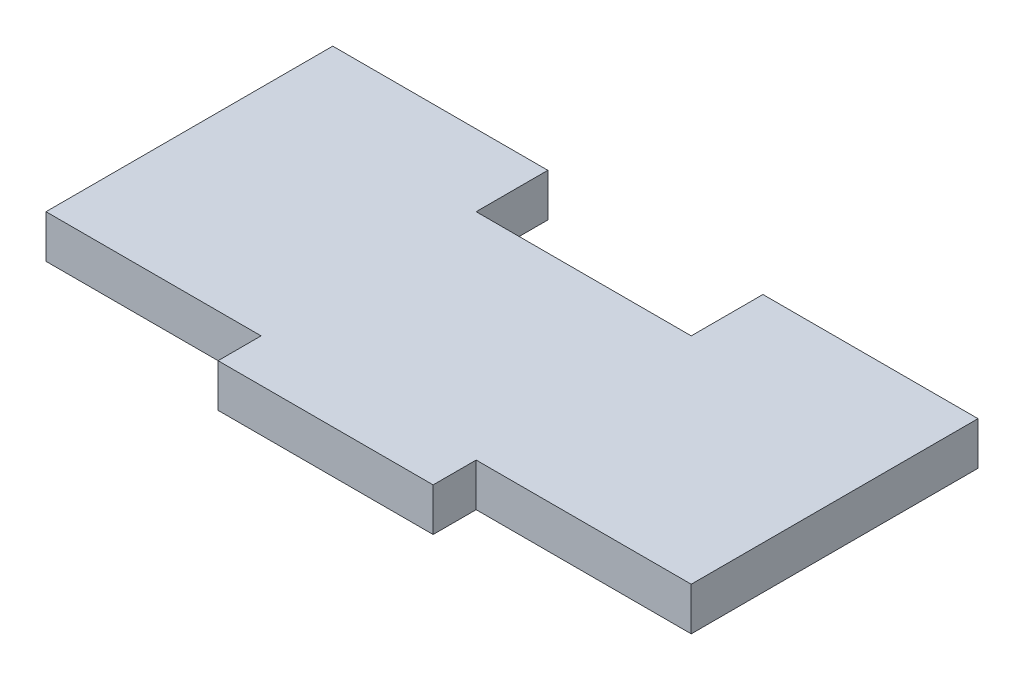
ISO-10303-21;
HEADER;
FILE_DESCRIPTION(('STEP AP214'),'2;1');
FILE_NAME('part.step','',(''),(''),'','','');
FILE_SCHEMA(('AUTOMOTIVE_DESIGN { 1 0 10303 214 1 1 1 1 }'));
ENDSEC;
DATA;
#1=APPLICATION_CONTEXT('core data for automotive mechanical design processes');
#2=APPLICATION_PROTOCOL_DEFINITION('international standard','automotive_design',2000,#1);
#3=PRODUCT_CONTEXT('',#1,'mechanical');
#4=PRODUCT('Part','Part','',(#3));
#5=PRODUCT_RELATED_PRODUCT_CATEGORY('part','',(#4));
#6=PRODUCT_DEFINITION_FORMATION('','',#4);
#7=PRODUCT_DEFINITION_CONTEXT('part definition',#1,'design');
#8=PRODUCT_DEFINITION('design','',#6,#7);
#9=PRODUCT_DEFINITION_SHAPE('','',#8);
#10=(LENGTH_UNIT() NAMED_UNIT(*) SI_UNIT(.MILLI.,.METRE.));
#11=(NAMED_UNIT(*) PLANE_ANGLE_UNIT() SI_UNIT($,.RADIAN.));
#12=(NAMED_UNIT(*) SI_UNIT($,.STERADIAN.) SOLID_ANGLE_UNIT());
#13=UNCERTAINTY_MEASURE_WITH_UNIT(LENGTH_MEASURE(1.E-05),#10,'distance_accuracy_value','');
#14=(GEOMETRIC_REPRESENTATION_CONTEXT(3) GLOBAL_UNCERTAINTY_ASSIGNED_CONTEXT((#13)) GLOBAL_UNIT_ASSIGNED_CONTEXT((#10,
#11,#12)) REPRESENTATION_CONTEXT('',''));
#15=CARTESIAN_POINT('',(0.,0.,0.));
#16=DIRECTION('',(0.,0.,1.));
#17=DIRECTION('',(1.,0.,0.));
#18=AXIS2_PLACEMENT_3D('',#15,#16,#17);
#19=CARTESIAN_POINT('',(-22.5,3.,-11.5));
#20=DIRECTION('',(0.,0.,1.));
#21=DIRECTION('',(1.,0.,0.));
#22=AXIS2_PLACEMENT_3D('',#19,#20,#21);
#23=PLANE('',#22);
#24=DIRECTION('',(-1.,0.,0.));
#25=VECTOR('',#24,1.);
#26=CARTESIAN_POINT('',(-22.5,3.,-11.5));
#27=LINE('',#26,#25);
#28=CARTESIAN_POINT('',(-7.50000000000001,3.,-11.5));
#29=VERTEX_POINT('',#28);
#30=CARTESIAN_POINT('',(-22.5,3.,-11.5));
#31=VERTEX_POINT('',#30);
#32=EDGE_CURVE('E158',#29,#31,#27,.T.);
#33=ORIENTED_EDGE('',*,*,#32,.F.);
#34=DIRECTION('',(0.,1.,0.));
#35=VECTOR('',#34,1.);
#36=CARTESIAN_POINT('',(-7.50000000000001,0.,-11.5));
#37=LINE('',#36,#35);
#38=CARTESIAN_POINT('',(-7.50000000000001,0.,-11.5));
#39=VERTEX_POINT('',#38);
#40=EDGE_CURVE('E184',#39,#29,#37,.T.);
#41=ORIENTED_EDGE('',*,*,#40,.F.);
#42=DIRECTION('',(-1.,0.,0.));
#43=VECTOR('',#42,1.);
#44=CARTESIAN_POINT('',(-22.5,0.,-11.5));
#45=LINE('',#44,#43);
#46=CARTESIAN_POINT('',(-22.5,0.,-11.5));
#47=VERTEX_POINT('',#46);
#48=EDGE_CURVE('E183',#39,#47,#45,.T.);
#49=ORIENTED_EDGE('',*,*,#48,.T.);
#50=DIRECTION('',(0.,-1.,0.));
#51=VECTOR('',#50,1.);
#52=CARTESIAN_POINT('',(-22.5,3.,-11.5));
#53=LINE('',#52,#51);
#54=EDGE_CURVE('E48',#31,#47,#53,.T.);
#55=ORIENTED_EDGE('',*,*,#54,.F.);
#56=EDGE_LOOP('',(#33,#41,#49,#55));
#57=FACE_BOUND('',#56,.T.);
#58=ADVANCED_FACE('F39',(#57),#23,.F.);
#59=CARTESIAN_POINT('',(22.5,3.,11.5));
#60=DIRECTION('',(-1.,0.,0.));
#61=DIRECTION('',(0.,0.,1.));
#62=AXIS2_PLACEMENT_3D('',#59,#60,#61);
#63=PLANE('',#62);
#64=DIRECTION('',(0.,0.,-1.));
#65=VECTOR('',#64,1.);
#66=CARTESIAN_POINT('',(22.5,3.,11.5));
#67=LINE('',#66,#65);
#68=CARTESIAN_POINT('',(22.5,3.,8.5));
#69=VERTEX_POINT('',#68);
#70=CARTESIAN_POINT('',(22.5,3.,-11.5));
#71=VERTEX_POINT('',#70);
#72=EDGE_CURVE('E153',#69,#71,#67,.T.);
#73=ORIENTED_EDGE('',*,*,#72,.F.);
#74=DIRECTION('',(0.,1.,0.));
#75=VECTOR('',#74,1.);
#76=CARTESIAN_POINT('',(22.5,0.,8.5));
#77=LINE('',#76,#75);
#78=CARTESIAN_POINT('',(22.5,0.,8.5));
#79=VERTEX_POINT('',#78);
#80=EDGE_CURVE('E242',#79,#69,#77,.T.);
#81=ORIENTED_EDGE('',*,*,#80,.F.);
#82=DIRECTION('',(0.,0.,-1.));
#83=VECTOR('',#82,1.);
#84=CARTESIAN_POINT('',(22.5,0.,11.5));
#85=LINE('',#84,#83);
#86=CARTESIAN_POINT('',(22.5,0.,-11.5));
#87=VERTEX_POINT('',#86);
#88=EDGE_CURVE('E181',#79,#87,#85,.T.);
#89=ORIENTED_EDGE('',*,*,#88,.T.);
#90=DIRECTION('',(0.,-1.,0.));
#91=VECTOR('',#90,1.);
#92=CARTESIAN_POINT('',(22.5,3.,-11.5));
#93=LINE('',#92,#91);
#94=EDGE_CURVE('E11',#71,#87,#93,.T.);
#95=ORIENTED_EDGE('',*,*,#94,.F.);
#96=EDGE_LOOP('',(#73,#81,#89,#95));
#97=FACE_BOUND('',#96,.T.);
#98=ADVANCED_FACE('F41',(#97),#63,.F.);
#99=CARTESIAN_POINT('',(7.49999999999999,0.,-11.5));
#100=VERTEX_POINT('',#99);
#101=EDGE_CURVE('E161',#87,#100,#45,.T.);
#102=ORIENTED_EDGE('',*,*,#101,.T.);
#103=DIRECTION('',(0.,1.,0.));
#104=VECTOR('',#103,1.);
#105=CARTESIAN_POINT('',(7.49999999999999,0.,-11.5));
#106=LINE('',#105,#104);
#107=CARTESIAN_POINT('',(7.49999999999999,3.,-11.5));
#108=VERTEX_POINT('',#107);
#109=EDGE_CURVE('E220',#100,#108,#106,.T.);
#110=ORIENTED_EDGE('',*,*,#109,.T.);
#111=EDGE_CURVE('E177',#71,#108,#27,.T.);
#112=ORIENTED_EDGE('',*,*,#111,.F.);
#113=ORIENTED_EDGE('',*,*,#94,.T.);
#114=EDGE_LOOP('',(#102,#110,#112,#113));
#115=FACE_BOUND('',#114,.T.);
#116=ADVANCED_FACE('F284',(#115),#23,.F.);
#117=CARTESIAN_POINT('',(-22.5,3.,11.5));
#118=DIRECTION('',(1.,0.,0.));
#119=DIRECTION('',(0.,0.,-1.));
#120=AXIS2_PLACEMENT_3D('',#117,#118,#119);
#121=PLANE('',#120);
#122=DIRECTION('',(0.,0.,1.));
#123=VECTOR('',#122,1.);
#124=CARTESIAN_POINT('',(-22.5,0.,11.5));
#125=LINE('',#124,#123);
#126=CARTESIAN_POINT('',(-22.5,0.,8.5));
#127=VERTEX_POINT('',#126);
#128=EDGE_CURVE('E154',#47,#127,#125,.T.);
#129=ORIENTED_EDGE('',*,*,#128,.T.);
#130=DIRECTION('',(0.,1.,0.));
#131=VECTOR('',#130,1.);
#132=CARTESIAN_POINT('',(-22.5,0.,8.5));
#133=LINE('',#132,#131);
#134=CARTESIAN_POINT('',(-22.5,3.,8.5));
#135=VERTEX_POINT('',#134);
#136=EDGE_CURVE('E200',#127,#135,#133,.T.);
#137=ORIENTED_EDGE('',*,*,#136,.T.);
#138=DIRECTION('',(0.,0.,1.));
#139=VECTOR('',#138,1.);
#140=CARTESIAN_POINT('',(-22.5,3.,11.5));
#141=LINE('',#140,#139);
#142=EDGE_CURVE('E171',#31,#135,#141,.T.);
#143=ORIENTED_EDGE('',*,*,#142,.F.);
#144=ORIENTED_EDGE('',*,*,#54,.T.);
#145=EDGE_LOOP('',(#129,#137,#143,#144));
#146=FACE_BOUND('',#145,.T.);
#147=ADVANCED_FACE('F199',(#146),#121,.F.);
#148=CARTESIAN_POINT('',(-22.5,3.,11.5));
#149=DIRECTION('',(0.,0.,-1.));
#150=DIRECTION('',(-1.,0.,0.));
#151=AXIS2_PLACEMENT_3D('',#148,#149,#150);
#152=PLANE('',#151);
#153=DIRECTION('',(1.,0.,0.));
#154=VECTOR('',#153,1.);
#155=CARTESIAN_POINT('',(-22.5,3.,11.5));
#156=LINE('',#155,#154);
#157=CARTESIAN_POINT('',(-7.5,3.,11.5));
#158=VERTEX_POINT('',#157);
#159=CARTESIAN_POINT('',(7.5,3.,11.5));
#160=VERTEX_POINT('',#159);
#161=EDGE_CURVE('E147',#158,#160,#156,.T.);
#162=ORIENTED_EDGE('',*,*,#161,.F.);
#163=DIRECTION('',(0.,1.,0.));
#164=VECTOR('',#163,1.);
#165=CARTESIAN_POINT('',(-7.5,0.,11.5));
#166=LINE('',#165,#164);
#167=CARTESIAN_POINT('',(-7.5,0.,11.5));
#168=VERTEX_POINT('',#167);
#169=EDGE_CURVE('E132',#168,#158,#166,.T.);
#170=ORIENTED_EDGE('',*,*,#169,.F.);
#171=DIRECTION('',(1.,0.,0.));
#172=VECTOR('',#171,1.);
#173=CARTESIAN_POINT('',(-22.5,0.,11.5));
#174=LINE('',#173,#172);
#175=CARTESIAN_POINT('',(7.5,0.,11.5));
#176=VERTEX_POINT('',#175);
#177=EDGE_CURVE('E145',#168,#176,#174,.T.);
#178=ORIENTED_EDGE('',*,*,#177,.T.);
#179=DIRECTION('',(0.,1.,0.));
#180=VECTOR('',#179,1.);
#181=CARTESIAN_POINT('',(7.5,0.,11.5));
#182=LINE('',#181,#180);
#183=EDGE_CURVE('E248',#176,#160,#182,.T.);
#184=ORIENTED_EDGE('',*,*,#183,.T.);
#185=EDGE_LOOP('',(#162,#170,#178,#184));
#186=FACE_BOUND('',#185,.T.);
#187=ADVANCED_FACE('F143',(#186),#152,.F.);
#188=CARTESIAN_POINT('',(0.,3.,0.));
#189=DIRECTION('',(0.,-1.,0.));
#190=DIRECTION('',(0.,0.,-1.));
#191=AXIS2_PLACEMENT_3D('',#188,#189,#190);
#192=PLANE('',#191);
#193=ORIENTED_EDGE('',*,*,#142,.T.);
#194=DIRECTION('',(-1.,0.,0.));
#195=VECTOR('',#194,1.);
#196=CARTESIAN_POINT('',(-22.5,3.,8.5));
#197=LINE('',#196,#195);
#198=CARTESIAN_POINT('',(-7.5,3.,8.5));
#199=VERTEX_POINT('',#198);
#200=EDGE_CURVE('E138',#199,#135,#197,.T.);
#201=ORIENTED_EDGE('',*,*,#200,.F.);
#202=DIRECTION('',(0.,0.,-1.));
#203=VECTOR('',#202,1.);
#204=CARTESIAN_POINT('',(-7.5,3.,11.5));
#205=LINE('',#204,#203);
#206=EDGE_CURVE('E251',#158,#199,#205,.T.);
#207=ORIENTED_EDGE('',*,*,#206,.F.);
#208=ORIENTED_EDGE('',*,*,#161,.T.);
#209=DIRECTION('',(0.,0.,1.));
#210=VECTOR('',#209,1.);
#211=CARTESIAN_POINT('',(7.5,3.,11.5));
#212=LINE('',#211,#210);
#213=CARTESIAN_POINT('',(7.5,3.,8.5));
#214=VERTEX_POINT('',#213);
#215=EDGE_CURVE('E252',#214,#160,#212,.T.);
#216=ORIENTED_EDGE('',*,*,#215,.F.);
#217=DIRECTION('',(-1.,0.,0.));
#218=VECTOR('',#217,1.);
#219=CARTESIAN_POINT('',(22.5,3.,8.5));
#220=LINE('',#219,#218);
#221=EDGE_CURVE('E256',#69,#214,#220,.T.);
#222=ORIENTED_EDGE('',*,*,#221,.F.);
#223=ORIENTED_EDGE('',*,*,#72,.T.);
#224=ORIENTED_EDGE('',*,*,#111,.T.);
#225=DIRECTION('',(0.,0.,-1.));
#226=VECTOR('',#225,1.);
#227=CARTESIAN_POINT('',(7.49999999999999,3.,-11.5));
#228=LINE('',#227,#226);
#229=CARTESIAN_POINT('',(7.49999999999999,3.,-6.5));
#230=VERTEX_POINT('',#229);
#231=EDGE_CURVE('E225',#230,#108,#228,.T.);
#232=ORIENTED_EDGE('',*,*,#231,.F.);
#233=DIRECTION('',(1.,0.,0.));
#234=VECTOR('',#233,1.);
#235=CARTESIAN_POINT('',(-7.50000000000001,3.,-6.5));
#236=LINE('',#235,#234);
#237=CARTESIAN_POINT('',(-7.50000000000001,3.,-6.5));
#238=VERTEX_POINT('',#237);
#239=EDGE_CURVE('E228',#238,#230,#236,.T.);
#240=ORIENTED_EDGE('',*,*,#239,.F.);
#241=DIRECTION('',(0.,0.,1.));
#242=VECTOR('',#241,1.);
#243=CARTESIAN_POINT('',(-7.50000000000001,3.,-11.5));
#244=LINE('',#243,#242);
#245=EDGE_CURVE('E202',#29,#238,#244,.T.);
#246=ORIENTED_EDGE('',*,*,#245,.F.);
#247=ORIENTED_EDGE('',*,*,#32,.T.);
#248=EDGE_LOOP('',(#193,#201,#207,#208,#216,#222,#223,#224,#232,#240,#246,#247));
#249=FACE_BOUND('',#248,.T.);
#250=ADVANCED_FACE('F205',(#249),#192,.F.);
#251=CARTESIAN_POINT('',(0.,0.,0.));
#252=DIRECTION('',(0.,-1.,0.));
#253=DIRECTION('',(0.,0.,-1.));
#254=AXIS2_PLACEMENT_3D('',#251,#252,#253);
#255=PLANE('',#254);
#256=DIRECTION('',(-1.,0.,0.));
#257=VECTOR('',#256,1.);
#258=CARTESIAN_POINT('',(-22.5,0.,8.5));
#259=LINE('',#258,#257);
#260=CARTESIAN_POINT('',(-7.5,0.,8.5));
#261=VERTEX_POINT('',#260);
#262=EDGE_CURVE('E55',#261,#127,#259,.T.);
#263=ORIENTED_EDGE('',*,*,#262,.T.);
#264=ORIENTED_EDGE('',*,*,#128,.F.);
#265=ORIENTED_EDGE('',*,*,#48,.F.);
#266=DIRECTION('',(0.,0.,1.));
#267=VECTOR('',#266,1.);
#268=CARTESIAN_POINT('',(-7.50000000000001,0.,-11.5));
#269=LINE('',#268,#267);
#270=CARTESIAN_POINT('',(-7.50000000000001,0.,-6.5));
#271=VERTEX_POINT('',#270);
#272=EDGE_CURVE('E197',#39,#271,#269,.T.);
#273=ORIENTED_EDGE('',*,*,#272,.T.);
#274=DIRECTION('',(1.,0.,0.));
#275=VECTOR('',#274,1.);
#276=CARTESIAN_POINT('',(-7.50000000000001,0.,-6.5));
#277=LINE('',#276,#275);
#278=CARTESIAN_POINT('',(7.49999999999999,0.,-6.5));
#279=VERTEX_POINT('',#278);
#280=EDGE_CURVE('E237',#271,#279,#277,.T.);
#281=ORIENTED_EDGE('',*,*,#280,.T.);
#282=DIRECTION('',(0.,0.,-1.));
#283=VECTOR('',#282,1.);
#284=CARTESIAN_POINT('',(7.49999999999999,0.,-11.5));
#285=LINE('',#284,#283);
#286=EDGE_CURVE('E217',#279,#100,#285,.T.);
#287=ORIENTED_EDGE('',*,*,#286,.T.);
#288=ORIENTED_EDGE('',*,*,#101,.F.);
#289=ORIENTED_EDGE('',*,*,#88,.F.);
#290=DIRECTION('',(-1.,0.,0.));
#291=VECTOR('',#290,1.);
#292=CARTESIAN_POINT('',(22.5,0.,8.5));
#293=LINE('',#292,#291);
#294=CARTESIAN_POINT('',(7.5,0.,8.5));
#295=VERTEX_POINT('',#294);
#296=EDGE_CURVE('E255',#79,#295,#293,.T.);
#297=ORIENTED_EDGE('',*,*,#296,.T.);
#298=DIRECTION('',(0.,0.,1.));
#299=VECTOR('',#298,1.);
#300=CARTESIAN_POINT('',(7.5,0.,11.5));
#301=LINE('',#300,#299);
#302=EDGE_CURVE('E63',#295,#176,#301,.T.);
#303=ORIENTED_EDGE('',*,*,#302,.T.);
#304=ORIENTED_EDGE('',*,*,#177,.F.);
#305=DIRECTION('',(0.,0.,-1.));
#306=VECTOR('',#305,1.);
#307=CARTESIAN_POINT('',(-7.5,0.,11.5));
#308=LINE('',#307,#306);
#309=EDGE_CURVE('E128',#168,#261,#308,.T.);
#310=ORIENTED_EDGE('',*,*,#309,.T.);
#311=EDGE_LOOP('',(#263,#264,#265,#273,#281,#287,#288,#289,#297,#303,#304,#310));
#312=FACE_BOUND('',#311,.T.);
#313=ADVANCED_FACE('F150',(#312),#255,.T.);
#314=CARTESIAN_POINT('',(-7.50000000000001,0.,-11.5));
#315=DIRECTION('',(-1.,0.,0.));
#316=DIRECTION('',(0.,0.,1.));
#317=AXIS2_PLACEMENT_3D('',#314,#315,#316);
#318=PLANE('',#317);
#319=ORIENTED_EDGE('',*,*,#245,.T.);
#320=DIRECTION('',(0.,1.,0.));
#321=VECTOR('',#320,1.);
#322=CARTESIAN_POINT('',(-7.50000000000001,0.,-6.5));
#323=LINE('',#322,#321);
#324=EDGE_CURVE('E213',#271,#238,#323,.T.);
#325=ORIENTED_EDGE('',*,*,#324,.F.);
#326=ORIENTED_EDGE('',*,*,#272,.F.);
#327=ORIENTED_EDGE('',*,*,#40,.T.);
#328=EDGE_LOOP('',(#319,#325,#326,#327));
#329=FACE_BOUND('',#328,.T.);
#330=ADVANCED_FACE('F301',(#329),#318,.F.);
#331=CARTESIAN_POINT('',(7.49999999999999,0.,-11.5));
#332=DIRECTION('',(1.,0.,0.));
#333=DIRECTION('',(0.,0.,-1.));
#334=AXIS2_PLACEMENT_3D('',#331,#332,#333);
#335=PLANE('',#334);
#336=ORIENTED_EDGE('',*,*,#231,.T.);
#337=ORIENTED_EDGE('',*,*,#109,.F.);
#338=ORIENTED_EDGE('',*,*,#286,.F.);
#339=DIRECTION('',(0.,1.,0.));
#340=VECTOR('',#339,1.);
#341=CARTESIAN_POINT('',(7.49999999999999,0.,-6.5));
#342=LINE('',#341,#340);
#343=EDGE_CURVE('E216',#279,#230,#342,.T.);
#344=ORIENTED_EDGE('',*,*,#343,.T.);
#345=EDGE_LOOP('',(#336,#337,#338,#344));
#346=FACE_BOUND('',#345,.T.);
#347=ADVANCED_FACE('F306',(#346),#335,.F.);
#348=CARTESIAN_POINT('',(-7.50000000000001,0.,-6.5));
#349=DIRECTION('',(0.,0.,1.));
#350=DIRECTION('',(1.,0.,0.));
#351=AXIS2_PLACEMENT_3D('',#348,#349,#350);
#352=PLANE('',#351);
#353=ORIENTED_EDGE('',*,*,#239,.T.);
#354=ORIENTED_EDGE('',*,*,#343,.F.);
#355=ORIENTED_EDGE('',*,*,#280,.F.);
#356=ORIENTED_EDGE('',*,*,#324,.T.);
#357=EDGE_LOOP('',(#353,#354,#355,#356));
#358=FACE_BOUND('',#357,.T.);
#359=ADVANCED_FACE('F308',(#358),#352,.F.);
#360=CARTESIAN_POINT('',(7.5,0.,11.5));
#361=DIRECTION('',(-1.,0.,0.));
#362=DIRECTION('',(0.,0.,1.));
#363=AXIS2_PLACEMENT_3D('',#360,#361,#362);
#364=PLANE('',#363);
#365=ORIENTED_EDGE('',*,*,#215,.T.);
#366=ORIENTED_EDGE('',*,*,#183,.F.);
#367=ORIENTED_EDGE('',*,*,#302,.F.);
#368=DIRECTION('',(0.,1.,0.));
#369=VECTOR('',#368,1.);
#370=CARTESIAN_POINT('',(7.5,0.,8.5));
#371=LINE('',#370,#369);
#372=EDGE_CURVE('E245',#295,#214,#371,.T.);
#373=ORIENTED_EDGE('',*,*,#372,.T.);
#374=EDGE_LOOP('',(#365,#366,#367,#373));
#375=FACE_BOUND('',#374,.T.);
#376=ADVANCED_FACE('F280',(#375),#364,.F.);
#377=CARTESIAN_POINT('',(22.5,0.,8.5));
#378=DIRECTION('',(0.,0.,-1.));
#379=DIRECTION('',(-1.,0.,0.));
#380=AXIS2_PLACEMENT_3D('',#377,#378,#379);
#381=PLANE('',#380);
#382=ORIENTED_EDGE('',*,*,#221,.T.);
#383=ORIENTED_EDGE('',*,*,#372,.F.);
#384=ORIENTED_EDGE('',*,*,#296,.F.);
#385=ORIENTED_EDGE('',*,*,#80,.T.);
#386=EDGE_LOOP('',(#382,#383,#384,#385));
#387=FACE_BOUND('',#386,.T.);
#388=ADVANCED_FACE('F273',(#387),#381,.F.);
#389=CARTESIAN_POINT('',(-22.5,0.,8.5));
#390=DIRECTION('',(0.,0.,-1.));
#391=DIRECTION('',(-1.,0.,0.));
#392=AXIS2_PLACEMENT_3D('',#389,#390,#391);
#393=PLANE('',#392);
#394=ORIENTED_EDGE('',*,*,#200,.T.);
#395=ORIENTED_EDGE('',*,*,#136,.F.);
#396=ORIENTED_EDGE('',*,*,#262,.F.);
#397=DIRECTION('',(0.,1.,0.));
#398=VECTOR('',#397,1.);
#399=CARTESIAN_POINT('',(-7.5,0.,8.5));
#400=LINE('',#399,#398);
#401=EDGE_CURVE('E134',#261,#199,#400,.T.);
#402=ORIENTED_EDGE('',*,*,#401,.T.);
#403=EDGE_LOOP('',(#394,#395,#396,#402));
#404=FACE_BOUND('',#403,.T.);
#405=ADVANCED_FACE('F271',(#404),#393,.F.);
#406=CARTESIAN_POINT('',(-7.5,0.,11.5));
#407=DIRECTION('',(1.,0.,0.));
#408=DIRECTION('',(0.,0.,-1.));
#409=AXIS2_PLACEMENT_3D('',#406,#407,#408);
#410=PLANE('',#409);
#411=ORIENTED_EDGE('',*,*,#206,.T.);
#412=ORIENTED_EDGE('',*,*,#401,.F.);
#413=ORIENTED_EDGE('',*,*,#309,.F.);
#414=ORIENTED_EDGE('',*,*,#169,.T.);
#415=EDGE_LOOP('',(#411,#412,#413,#414));
#416=FACE_BOUND('',#415,.T.);
#417=ADVANCED_FACE('F131',(#416),#410,.F.);
#418=CLOSED_SHELL('',(#58,#98,#116,#147,#187,#250,#313,#330,#347,#359,#376,#388,#405,#417));
#419=MANIFOLD_SOLID_BREP('B2',#418);
#420=ADVANCED_BREP_SHAPE_REPRESENTATION('',(#18,#419),#14);
#421=SHAPE_DEFINITION_REPRESENTATION(#9,#420);
ENDSEC;
END-ISO-10303-21;
